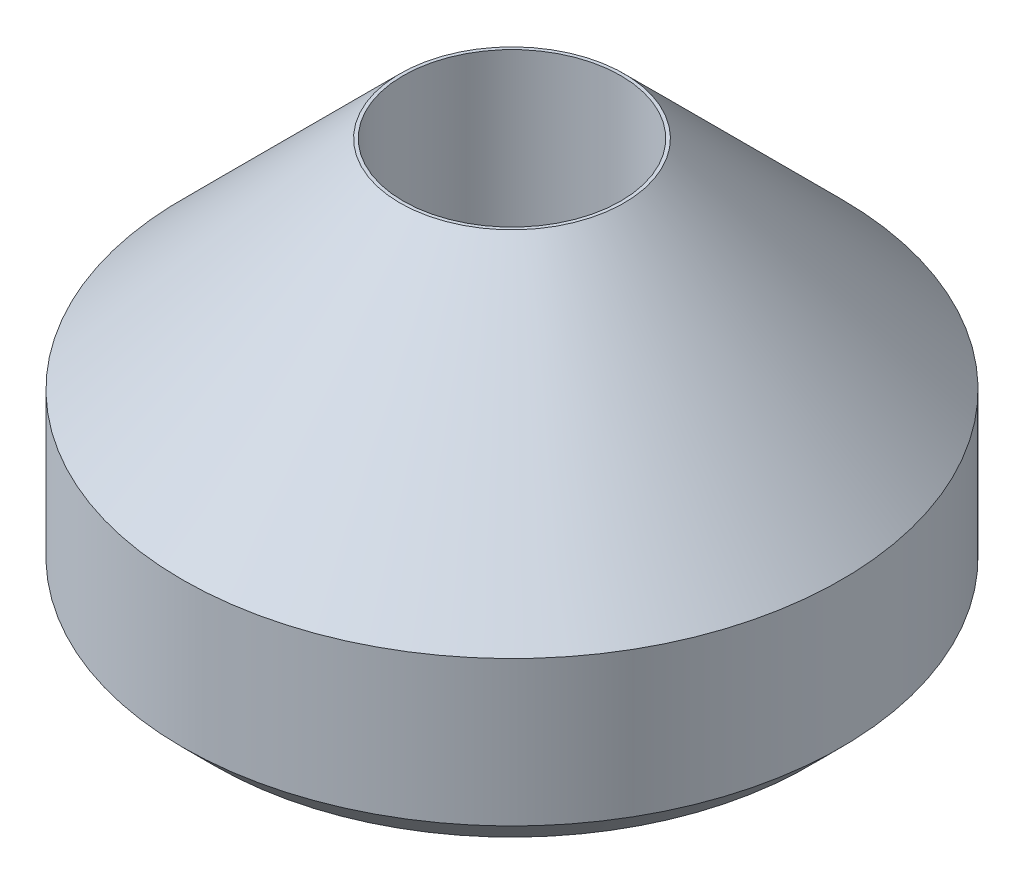
ISO-10303-21;
HEADER;
FILE_DESCRIPTION(('STEP AP214'),'2;1');
FILE_NAME('part.step','',(''),(''),'','','');
FILE_SCHEMA(('AUTOMOTIVE_DESIGN { 1 0 10303 214 1 1 1 1 }'));
ENDSEC;
DATA;
#1=APPLICATION_CONTEXT('core data for automotive mechanical design processes');
#2=APPLICATION_PROTOCOL_DEFINITION('international standard','automotive_design',2000,#1);
#3=PRODUCT_CONTEXT('',#1,'mechanical');
#4=PRODUCT('Part','Part','',(#3));
#5=PRODUCT_RELATED_PRODUCT_CATEGORY('part','',(#4));
#6=PRODUCT_DEFINITION_FORMATION('','',#4);
#7=PRODUCT_DEFINITION_CONTEXT('part definition',#1,'design');
#8=PRODUCT_DEFINITION('design','',#6,#7);
#9=PRODUCT_DEFINITION_SHAPE('','',#8);
#10=(LENGTH_UNIT() NAMED_UNIT(*) SI_UNIT(.MILLI.,.METRE.));
#11=(NAMED_UNIT(*) PLANE_ANGLE_UNIT() SI_UNIT($,.RADIAN.));
#12=(NAMED_UNIT(*) SI_UNIT($,.STERADIAN.) SOLID_ANGLE_UNIT());
#13=UNCERTAINTY_MEASURE_WITH_UNIT(LENGTH_MEASURE(1.E-05),#10,'distance_accuracy_value','');
#14=(GEOMETRIC_REPRESENTATION_CONTEXT(3) GLOBAL_UNCERTAINTY_ASSIGNED_CONTEXT((#13)) GLOBAL_UNIT_ASSIGNED_CONTEXT((#10,
#11,#12)) REPRESENTATION_CONTEXT('',''));
#15=CARTESIAN_POINT('',(0.,0.,0.));
#16=DIRECTION('',(0.,0.,1.));
#17=DIRECTION('',(1.,0.,0.));
#18=AXIS2_PLACEMENT_3D('',#15,#16,#17);
#19=CARTESIAN_POINT('',(0.,1.,0.));
#20=DIRECTION('',(0.,-1.,0.));
#21=DIRECTION('',(0.,0.,-1.));
#22=AXIS2_PLACEMENT_3D('',#19,#20,#21);
#23=CYLINDRICAL_SURFACE('',#22,5.);
#24=CARTESIAN_POINT('',(0.,0.499999999999998,0.));
#25=DIRECTION('',(0.,1.,0.));
#26=DIRECTION('',(0.,0.,1.));
#27=AXIS2_PLACEMENT_3D('',#24,#25,#26);
#28=CIRCLE('',#27,5.);
#29=CARTESIAN_POINT('',(0.,0.499999999999998,5.));
#30=VERTEX_POINT('',#29);
#31=EDGE_CURVE('E190',#30,#30,#28,.T.);
#32=ORIENTED_EDGE('',*,*,#31,.T.);
#33=EDGE_LOOP('',(#32));
#34=FACE_BOUND('',#33,.T.);
#35=CARTESIAN_POINT('',(0.,2.69999999999999,0.));
#36=DIRECTION('',(0.,1.,0.));
#37=DIRECTION('',(0.,0.,1.));
#38=AXIS2_PLACEMENT_3D('',#35,#36,#37);
#39=CIRCLE('',#38,5.);
#40=CARTESIAN_POINT('',(0.,2.69999999999999,5.));
#41=VERTEX_POINT('',#40);
#42=EDGE_CURVE('E186',#41,#41,#39,.F.);
#43=ORIENTED_EDGE('',*,*,#42,.T.);
#44=EDGE_LOOP('',(#43));
#45=FACE_BOUND('',#44,.T.);
#46=ADVANCED_FACE('F45',(#34,#45),#23,.T.);
#47=CARTESIAN_POINT('',(0.,0.,0.));
#48=DIRECTION('',(0.,1.,0.));
#49=DIRECTION('',(0.,0.,1.));
#50=AXIS2_PLACEMENT_3D('',#47,#48,#49);
#51=PLANE('',#50);
#52=CARTESIAN_POINT('',(0.,0.,-3.));
#53=DIRECTION('',(0.,1.,0.));
#54=DIRECTION('',(0.,0.,1.));
#55=AXIS2_PLACEMENT_3D('',#52,#53,#54);
#56=CIRCLE('',#55,0.5);
#57=CARTESIAN_POINT('',(0.5,0.,-3.));
#58=VERTEX_POINT('',#57);
#59=CARTESIAN_POINT('',(0.,0.,-3.5));
#60=VERTEX_POINT('',#59);
#61=EDGE_CURVE('E248',#58,#60,#56,.T.);
#62=ORIENTED_EDGE('',*,*,#61,.T.);
#63=CARTESIAN_POINT('',(0.,0.,-3.));
#64=DIRECTION('',(0.,1.,0.));
#65=DIRECTION('',(0.,0.,1.));
#66=AXIS2_PLACEMENT_3D('',#63,#64,#65);
#67=CIRCLE('',#66,0.5);
#68=CARTESIAN_POINT('',(-0.5,0.,-3.));
#69=VERTEX_POINT('',#68);
#70=EDGE_CURVE('E142',#60,#69,#67,.T.);
#71=ORIENTED_EDGE('',*,*,#70,.T.);
#72=DIRECTION('',(0.,0.,-1.));
#73=VECTOR('',#72,1.);
#74=CARTESIAN_POINT('',(-0.5,0.,-3.5));
#75=LINE('',#74,#73);
#76=CARTESIAN_POINT('',(-0.5,0.,-0.5));
#77=VERTEX_POINT('',#76);
#78=EDGE_CURVE('E170',#77,#69,#75,.T.);
#79=ORIENTED_EDGE('',*,*,#78,.F.);
#80=CARTESIAN_POINT('',(0.,0.,-0.5));
#81=DIRECTION('',(0.,1.,0.));
#82=DIRECTION('',(0.,0.,1.));
#83=AXIS2_PLACEMENT_3D('',#80,#81,#82);
#84=CIRCLE('',#83,0.5);
#85=CARTESIAN_POINT('',(0.,0.,0.));
#86=VERTEX_POINT('',#85);
#87=EDGE_CURVE('E69',#77,#86,#84,.T.);
#88=ORIENTED_EDGE('',*,*,#87,.T.);
#89=CARTESIAN_POINT('',(0.,0.,-0.5));
#90=DIRECTION('',(0.,1.,0.));
#91=DIRECTION('',(0.,0.,1.));
#92=AXIS2_PLACEMENT_3D('',#89,#90,#91);
#93=CIRCLE('',#92,0.5);
#94=CARTESIAN_POINT('',(0.5,0.,-0.5));
#95=VERTEX_POINT('',#94);
#96=EDGE_CURVE('E251',#86,#95,#93,.T.);
#97=ORIENTED_EDGE('',*,*,#96,.T.);
#98=DIRECTION('',(0.,0.,1.));
#99=VECTOR('',#98,1.);
#100=CARTESIAN_POINT('',(0.5,0.,0.));
#101=LINE('',#100,#99);
#102=EDGE_CURVE('E290',#58,#95,#101,.T.);
#103=ORIENTED_EDGE('',*,*,#102,.F.);
#104=EDGE_LOOP('',(#62,#71,#79,#88,#97,#103));
#105=FACE_BOUND('',#104,.T.);
#106=CARTESIAN_POINT('',(-2.10623800172387,0.,-2.13629620607589));
#107=DIRECTION('',(0.,1.,0.));
#108=DIRECTION('',(0.,0.,1.));
#109=AXIS2_PLACEMENT_3D('',#106,#107,#108);
#110=CIRCLE('',#109,0.5);
#111=CARTESIAN_POINT('',(-1.75519833476989,0.,-1.78024683839657));
#112=VERTEX_POINT('',#111);
#113=CARTESIAN_POINT('',(-1.69666197957938,0.,-2.42308442425141));
#114=VERTEX_POINT('',#113);
#115=EDGE_CURVE('E55',#112,#114,#110,.T.);
#116=ORIENTED_EDGE('',*,*,#115,.T.);
#117=CARTESIAN_POINT('',(-2.10623800172387,0.,-2.13629620607589));
#118=DIRECTION('',(0.,1.,0.));
#119=DIRECTION('',(0.,0.,1.));
#120=AXIS2_PLACEMENT_3D('',#117,#118,#119);
#121=CIRCLE('',#120,0.5);
#122=CARTESIAN_POINT('',(-2.45727766867785,0.,-2.4923455737552));
#123=VERTEX_POINT('',#122);
#124=EDGE_CURVE('E11',#114,#123,#121,.T.);
#125=ORIENTED_EDGE('',*,*,#124,.T.);
#126=CARTESIAN_POINT('',(0.,0.,0.));
#127=DIRECTION('',(0.,-1.,0.));
#128=DIRECTION('',(0.,0.,-1.));
#129=AXIS2_PLACEMENT_3D('',#126,#127,#128);
#130=CIRCLE('',#129,3.5);
#131=CARTESIAN_POINT('',(2.45727766867785,0.,-2.4923455737552));
#132=VERTEX_POINT('',#131);
#133=EDGE_CURVE('E163',#132,#123,#130,.T.);
#134=ORIENTED_EDGE('',*,*,#133,.F.);
#135=CARTESIAN_POINT('',(2.10623800172387,0.,-2.13629620607589));
#136=DIRECTION('',(0.,1.,0.));
#137=DIRECTION('',(0.,0.,1.));
#138=AXIS2_PLACEMENT_3D('',#135,#136,#137);
#139=CIRCLE('',#138,0.5);
#140=CARTESIAN_POINT('',(1.69666197957938,0.,-2.42308442425141));
#141=VERTEX_POINT('',#140);
#142=EDGE_CURVE('E245',#132,#141,#139,.T.);
#143=ORIENTED_EDGE('',*,*,#142,.T.);
#144=CARTESIAN_POINT('',(2.10623800172387,0.,-2.13629620607589));
#145=DIRECTION('',(0.,1.,0.));
#146=DIRECTION('',(0.,0.,1.));
#147=AXIS2_PLACEMENT_3D('',#144,#145,#146);
#148=CIRCLE('',#147,0.5);
#149=CARTESIAN_POINT('',(1.7551983347699,0.,-1.78024683839657));
#150=VERTEX_POINT('',#149);
#151=EDGE_CURVE('E160',#141,#150,#148,.T.);
#152=ORIENTED_EDGE('',*,*,#151,.T.);
#153=CARTESIAN_POINT('',(0.,0.,0.));
#154=DIRECTION('',(0.,1.,0.));
#155=DIRECTION('',(0.,0.,-1.));
#156=AXIS2_PLACEMENT_3D('',#153,#154,#155);
#157=CIRCLE('',#156,2.5);
#158=EDGE_CURVE('E149',#112,#150,#157,.T.);
#159=ORIENTED_EDGE('',*,*,#158,.F.);
#160=EDGE_LOOP('',(#116,#125,#134,#143,#152,#159));
#161=FACE_BOUND('',#160,.T.);
#162=CARTESIAN_POINT('',(0.,0.,0.));
#163=DIRECTION('',(0.,1.,0.));
#164=DIRECTION('',(0.,0.,1.));
#165=AXIS2_PLACEMENT_3D('',#162,#163,#164);
#166=CIRCLE('',#165,4.5);
#167=CARTESIAN_POINT('',(0.,0.,4.5));
#168=VERTEX_POINT('',#167);
#169=EDGE_CURVE('E155',#168,#168,#166,.F.);
#170=ORIENTED_EDGE('',*,*,#169,.T.);
#171=EDGE_LOOP('',(#170));
#172=FACE_BOUND('',#171,.T.);
#173=ADVANCED_FACE('F157',(#105,#161,#172),#51,.F.);
#174=CARTESIAN_POINT('',(0.,6.,0.));
#175=DIRECTION('',(0.,1.,0.));
#176=DIRECTION('',(0.,0.,1.));
#177=AXIS2_PLACEMENT_3D('',#174,#175,#176);
#178=PLANE('',#177);
#179=CARTESIAN_POINT('',(0.,6.,0.));
#180=DIRECTION('',(0.,1.,0.));
#181=DIRECTION('',(0.,0.,1.));
#182=AXIS2_PLACEMENT_3D('',#179,#180,#181);
#183=CIRCLE('',#182,1.7);
#184=CARTESIAN_POINT('',(0.,6.,1.7));
#185=VERTEX_POINT('',#184);
#186=EDGE_CURVE('E178',#185,#185,#183,.T.);
#187=ORIENTED_EDGE('',*,*,#186,.T.);
#188=EDGE_LOOP('',(#187));
#189=FACE_BOUND('',#188,.T.);
#190=CARTESIAN_POINT('',(0.,6.,0.));
#191=DIRECTION('',(0.,1.,0.));
#192=DIRECTION('',(0.,0.,1.));
#193=AXIS2_PLACEMENT_3D('',#190,#191,#192);
#194=CIRCLE('',#193,1.65);
#195=CARTESIAN_POINT('',(0.,6.,1.65));
#196=VERTEX_POINT('',#195);
#197=EDGE_CURVE('E179',#196,#196,#194,.T.);
#198=ORIENTED_EDGE('',*,*,#197,.F.);
#199=EDGE_LOOP('',(#198));
#200=FACE_BOUND('',#199,.T.);
#201=ADVANCED_FACE('F334',(#189,#200),#178,.T.);
#202=CARTESIAN_POINT('',(0.,3.,0.));
#203=DIRECTION('',(0.,1.,0.));
#204=DIRECTION('',(0.,0.,1.));
#205=AXIS2_PLACEMENT_3D('',#202,#203,#204);
#206=CYLINDRICAL_SURFACE('',#205,1.65);
#207=CARTESIAN_POINT('',(0.,3.,0.));
#208=DIRECTION('',(0.,1.,0.));
#209=DIRECTION('',(0.,0.,1.));
#210=AXIS2_PLACEMENT_3D('',#207,#208,#209);
#211=CIRCLE('',#210,1.65);
#212=CARTESIAN_POINT('',(0.,3.,1.65));
#213=VERTEX_POINT('',#212);
#214=EDGE_CURVE('E174',#213,#213,#211,.T.);
#215=ORIENTED_EDGE('',*,*,#214,.F.);
#216=EDGE_LOOP('',(#215));
#217=FACE_BOUND('',#216,.T.);
#218=ORIENTED_EDGE('',*,*,#197,.T.);
#219=EDGE_LOOP('',(#218));
#220=FACE_BOUND('',#219,.T.);
#221=ADVANCED_FACE('F367',(#217,#220),#206,.F.);
#222=CARTESIAN_POINT('',(0.,3.,0.));
#223=DIRECTION('',(0.,1.,0.));
#224=DIRECTION('',(0.,0.,1.));
#225=AXIS2_PLACEMENT_3D('',#222,#223,#224);
#226=PLANE('',#225);
#227=ORIENTED_EDGE('',*,*,#214,.T.);
#228=EDGE_LOOP('',(#227));
#229=FACE_BOUND('',#228,.T.);
#230=ADVANCED_FACE('F346',(#229),#226,.T.);
#231=CARTESIAN_POINT('',(0.,6.,0.));
#232=DIRECTION('',(0.,-1.,0.));
#233=DIRECTION('',(0.,0.,-1.));
#234=AXIS2_PLACEMENT_3D('',#231,#232,#233);
#235=CONICAL_SURFACE('',#234,1.7,0.785398163397447);
#236=ORIENTED_EDGE('',*,*,#42,.F.);
#237=EDGE_LOOP('',(#236));
#238=FACE_BOUND('',#237,.T.);
#239=ORIENTED_EDGE('',*,*,#186,.F.);
#240=EDGE_LOOP('',(#239));
#241=FACE_BOUND('',#240,.T.);
#242=ADVANCED_FACE('F340',(#238,#241),#235,.T.);
#243=CARTESIAN_POINT('',(0.,0.499999999999998,0.));
#244=DIRECTION('',(0.,1.,0.));
#245=DIRECTION('',(0.,0.,1.));
#246=AXIS2_PLACEMENT_3D('',#243,#244,#245);
#247=CONICAL_SURFACE('',#246,5.,0.785398163397449);
#248=ORIENTED_EDGE('',*,*,#169,.F.);
#249=EDGE_LOOP('',(#248));
#250=FACE_BOUND('',#249,.T.);
#251=ORIENTED_EDGE('',*,*,#31,.F.);
#252=EDGE_LOOP('',(#251));
#253=FACE_BOUND('',#252,.T.);
#254=ADVANCED_FACE('F345',(#250,#253),#247,.T.);
#255=CARTESIAN_POINT('',(0.,1.,0.));
#256=DIRECTION('',(0.,-1.,0.));
#257=DIRECTION('',(0.,0.,-1.));
#258=AXIS2_PLACEMENT_3D('',#255,#256,#257);
#259=CYLINDRICAL_SURFACE('',#258,3.5);
#260=CARTESIAN_POINT('',(0.,1.,0.));
#261=DIRECTION('',(0.,-1.,0.));
#262=DIRECTION('',(0.,0.,-1.));
#263=AXIS2_PLACEMENT_3D('',#260,#261,#262);
#264=CIRCLE('',#263,3.5);
#265=CARTESIAN_POINT('',(2.45727766867785,1.,-2.4923455737552));
#266=VERTEX_POINT('',#265);
#267=CARTESIAN_POINT('',(-2.45727766867785,1.,-2.4923455737552));
#268=VERTEX_POINT('',#267);
#269=EDGE_CURVE('E162',#266,#268,#264,.T.);
#270=ORIENTED_EDGE('',*,*,#269,.F.);
#271=DIRECTION('',(0.,-1.,0.));
#272=VECTOR('',#271,1.);
#273=CARTESIAN_POINT('',(2.45727766867785,1.,-2.4923455737552));
#274=LINE('',#273,#272);
#275=EDGE_CURVE('E214',#266,#132,#274,.T.);
#276=ORIENTED_EDGE('',*,*,#275,.T.);
#277=ORIENTED_EDGE('',*,*,#133,.T.);
#278=DIRECTION('',(0.,-1.,0.));
#279=VECTOR('',#278,1.);
#280=CARTESIAN_POINT('',(-2.45727766867785,1.,-2.4923455737552));
#281=LINE('',#280,#279);
#282=EDGE_CURVE('E211',#123,#268,#281,.F.);
#283=ORIENTED_EDGE('',*,*,#282,.T.);
#284=EDGE_LOOP('',(#270,#276,#277,#283));
#285=FACE_BOUND('',#284,.T.);
#286=ADVANCED_FACE('F309',(#285),#259,.F.);
#287=CARTESIAN_POINT('',(0.,1.,0.));
#288=DIRECTION('',(0.,-1.,0.));
#289=DIRECTION('',(0.,0.,-1.));
#290=AXIS2_PLACEMENT_3D('',#287,#288,#289);
#291=CYLINDRICAL_SURFACE('',#290,2.5);
#292=ORIENTED_EDGE('',*,*,#158,.T.);
#293=DIRECTION('',(0.,-1.,0.));
#294=VECTOR('',#293,1.);
#295=CARTESIAN_POINT('',(1.7551983347699,1.,-1.78024683839657));
#296=LINE('',#295,#294);
#297=CARTESIAN_POINT('',(1.7551983347699,1.,-1.78024683839657));
#298=VERTEX_POINT('',#297);
#299=EDGE_CURVE('E154',#150,#298,#296,.F.);
#300=ORIENTED_EDGE('',*,*,#299,.T.);
#301=CARTESIAN_POINT('',(0.,1.,0.));
#302=DIRECTION('',(0.,1.,0.));
#303=DIRECTION('',(0.,0.,-1.));
#304=AXIS2_PLACEMENT_3D('',#301,#302,#303);
#305=CIRCLE('',#304,2.5);
#306=CARTESIAN_POINT('',(-1.75519833476989,1.,-1.78024683839657));
#307=VERTEX_POINT('',#306);
#308=EDGE_CURVE('E152',#307,#298,#305,.T.);
#309=ORIENTED_EDGE('',*,*,#308,.F.);
#310=DIRECTION('',(0.,-1.,0.));
#311=VECTOR('',#310,1.);
#312=CARTESIAN_POINT('',(-1.75519833476989,1.,-1.78024683839657));
#313=LINE('',#312,#311);
#314=EDGE_CURVE('E139',#307,#112,#313,.T.);
#315=ORIENTED_EDGE('',*,*,#314,.T.);
#316=EDGE_LOOP('',(#292,#300,#309,#315));
#317=FACE_BOUND('',#316,.T.);
#318=ADVANCED_FACE('F147',(#317),#291,.T.);
#319=CARTESIAN_POINT('',(0.,1.,0.));
#320=DIRECTION('',(0.,-1.,0.));
#321=DIRECTION('',(0.,0.,-1.));
#322=AXIS2_PLACEMENT_3D('',#319,#320,#321);
#323=PLANE('',#322);
#324=ORIENTED_EDGE('',*,*,#308,.T.);
#325=CARTESIAN_POINT('',(2.10623800172387,1.,-2.13629620607589));
#326=DIRECTION('',(0.,-1.,0.));
#327=DIRECTION('',(0.,0.,-1.));
#328=AXIS2_PLACEMENT_3D('',#325,#326,#327);
#329=CIRCLE('',#328,0.5);
#330=CARTESIAN_POINT('',(1.69666197957938,1.,-2.42308442425141));
#331=VERTEX_POINT('',#330);
#332=EDGE_CURVE('E208',#298,#331,#329,.T.);
#333=ORIENTED_EDGE('',*,*,#332,.T.);
#334=CARTESIAN_POINT('',(2.10623800172387,1.,-2.13629620607589));
#335=DIRECTION('',(0.,-1.,0.));
#336=DIRECTION('',(0.,0.,-1.));
#337=AXIS2_PLACEMENT_3D('',#334,#335,#336);
#338=CIRCLE('',#337,0.5);
#339=EDGE_CURVE('E205',#331,#266,#338,.T.);
#340=ORIENTED_EDGE('',*,*,#339,.T.);
#341=ORIENTED_EDGE('',*,*,#269,.T.);
#342=CARTESIAN_POINT('',(-2.10623800172387,1.,-2.13629620607589));
#343=DIRECTION('',(0.,-1.,0.));
#344=DIRECTION('',(0.,0.,-1.));
#345=AXIS2_PLACEMENT_3D('',#342,#343,#344);
#346=CIRCLE('',#345,0.5);
#347=CARTESIAN_POINT('',(-1.69666197957938,1.,-2.42308442425141));
#348=VERTEX_POINT('',#347);
#349=EDGE_CURVE('E199',#268,#348,#346,.T.);
#350=ORIENTED_EDGE('',*,*,#349,.T.);
#351=CARTESIAN_POINT('',(-2.10623800172387,1.,-2.13629620607589));
#352=DIRECTION('',(0.,-1.,0.));
#353=DIRECTION('',(0.,0.,-1.));
#354=AXIS2_PLACEMENT_3D('',#351,#352,#353);
#355=CIRCLE('',#354,0.5);
#356=EDGE_CURVE('E202',#348,#307,#355,.T.);
#357=ORIENTED_EDGE('',*,*,#356,.T.);
#358=EDGE_LOOP('',(#324,#333,#340,#341,#350,#357));
#359=FACE_BOUND('',#358,.T.);
#360=ADVANCED_FACE('F300',(#359),#323,.T.);
#361=CARTESIAN_POINT('',(-0.5,1.,-3.5));
#362=DIRECTION('',(-1.,0.,0.));
#363=DIRECTION('',(0.,0.,1.));
#364=AXIS2_PLACEMENT_3D('',#361,#362,#363);
#365=PLANE('',#364);
#366=DIRECTION('',(0.,0.,-1.));
#367=VECTOR('',#366,1.);
#368=CARTESIAN_POINT('',(-0.5,1.,-3.5));
#369=LINE('',#368,#367);
#370=CARTESIAN_POINT('',(-0.5,1.,-0.5));
#371=VERTEX_POINT('',#370);
#372=CARTESIAN_POINT('',(-0.5,1.,-3.));
#373=VERTEX_POINT('',#372);
#374=EDGE_CURVE('E283',#371,#373,#369,.T.);
#375=ORIENTED_EDGE('',*,*,#374,.F.);
#376=DIRECTION('',(0.,-1.,0.));
#377=VECTOR('',#376,1.);
#378=CARTESIAN_POINT('',(-0.5,0.,-0.5));
#379=LINE('',#378,#377);
#380=EDGE_CURVE('E240',#371,#77,#379,.T.);
#381=ORIENTED_EDGE('',*,*,#380,.T.);
#382=ORIENTED_EDGE('',*,*,#78,.T.);
#383=DIRECTION('',(0.,-1.,0.));
#384=VECTOR('',#383,1.);
#385=CARTESIAN_POINT('',(-0.5,1.,-3.));
#386=LINE('',#385,#384);
#387=EDGE_CURVE('E237',#69,#373,#386,.F.);
#388=ORIENTED_EDGE('',*,*,#387,.T.);
#389=EDGE_LOOP('',(#375,#381,#382,#388));
#390=FACE_BOUND('',#389,.T.);
#391=ADVANCED_FACE('F286',(#390),#365,.F.);
#392=CARTESIAN_POINT('',(0.5,1.,0.));
#393=DIRECTION('',(1.,0.,0.));
#394=DIRECTION('',(0.,0.,-1.));
#395=AXIS2_PLACEMENT_3D('',#392,#393,#394);
#396=PLANE('',#395);
#397=DIRECTION('',(0.,0.,1.));
#398=VECTOR('',#397,1.);
#399=CARTESIAN_POINT('',(0.5,1.,0.));
#400=LINE('',#399,#398);
#401=CARTESIAN_POINT('',(0.5,1.,-3.));
#402=VERTEX_POINT('',#401);
#403=CARTESIAN_POINT('',(0.5,1.,-0.5));
#404=VERTEX_POINT('',#403);
#405=EDGE_CURVE('E262',#402,#404,#400,.T.);
#406=ORIENTED_EDGE('',*,*,#405,.F.);
#407=DIRECTION('',(0.,-1.,0.));
#408=VECTOR('',#407,1.);
#409=CARTESIAN_POINT('',(0.5,0.,-3.));
#410=LINE('',#409,#408);
#411=EDGE_CURVE('E221',#402,#58,#410,.T.);
#412=ORIENTED_EDGE('',*,*,#411,.T.);
#413=ORIENTED_EDGE('',*,*,#102,.T.);
#414=DIRECTION('',(0.,-1.,0.));
#415=VECTOR('',#414,1.);
#416=CARTESIAN_POINT('',(0.5,1.,-0.5));
#417=LINE('',#416,#415);
#418=EDGE_CURVE('E217',#95,#404,#417,.F.);
#419=ORIENTED_EDGE('',*,*,#418,.T.);
#420=EDGE_LOOP('',(#406,#412,#413,#419));
#421=FACE_BOUND('',#420,.T.);
#422=ADVANCED_FACE('F439',(#421),#396,.F.);
#423=CARTESIAN_POINT('',(0.,1.,0.));
#424=DIRECTION('',(0.,1.,0.));
#425=DIRECTION('',(0.,0.,1.));
#426=AXIS2_PLACEMENT_3D('',#423,#424,#425);
#427=PLANE('',#426);
#428=ORIENTED_EDGE('',*,*,#405,.T.);
#429=CARTESIAN_POINT('',(0.,1.,-0.5));
#430=DIRECTION('',(0.,1.,0.));
#431=DIRECTION('',(0.,0.,1.));
#432=AXIS2_PLACEMENT_3D('',#429,#430,#431);
#433=CIRCLE('',#432,0.5);
#434=CARTESIAN_POINT('',(0.,1.,0.));
#435=VERTEX_POINT('',#434);
#436=EDGE_CURVE('E234',#404,#435,#433,.F.);
#437=ORIENTED_EDGE('',*,*,#436,.T.);
#438=CARTESIAN_POINT('',(0.,1.,-0.5));
#439=DIRECTION('',(0.,1.,0.));
#440=DIRECTION('',(0.,0.,1.));
#441=AXIS2_PLACEMENT_3D('',#438,#439,#440);
#442=CIRCLE('',#441,0.5);
#443=EDGE_CURVE('E231',#435,#371,#442,.F.);
#444=ORIENTED_EDGE('',*,*,#443,.T.);
#445=ORIENTED_EDGE('',*,*,#374,.T.);
#446=CARTESIAN_POINT('',(0.,1.,-3.));
#447=DIRECTION('',(0.,1.,0.));
#448=DIRECTION('',(0.,0.,1.));
#449=AXIS2_PLACEMENT_3D('',#446,#447,#448);
#450=CIRCLE('',#449,0.5);
#451=CARTESIAN_POINT('',(0.,1.,-3.5));
#452=VERTEX_POINT('',#451);
#453=EDGE_CURVE('E225',#373,#452,#450,.F.);
#454=ORIENTED_EDGE('',*,*,#453,.T.);
#455=CARTESIAN_POINT('',(0.,1.,-3.));
#456=DIRECTION('',(0.,1.,0.));
#457=DIRECTION('',(0.,0.,1.));
#458=AXIS2_PLACEMENT_3D('',#455,#456,#457);
#459=CIRCLE('',#458,0.5);
#460=EDGE_CURVE('E228',#452,#402,#459,.F.);
#461=ORIENTED_EDGE('',*,*,#460,.T.);
#462=EDGE_LOOP('',(#428,#437,#444,#445,#454,#461));
#463=FACE_BOUND('',#462,.T.);
#464=ADVANCED_FACE('F282',(#463),#427,.F.);
#465=CARTESIAN_POINT('',(2.10623800172387,1.,-2.13629620607589));
#466=DIRECTION('',(0.,-1.,0.));
#467=DIRECTION('',(0.,0.,-1.));
#468=AXIS2_PLACEMENT_3D('',#465,#466,#467);
#469=CYLINDRICAL_SURFACE('',#468,0.5);
#470=ORIENTED_EDGE('',*,*,#275,.F.);
#471=ORIENTED_EDGE('',*,*,#339,.F.);
#472=DIRECTION('',(0.,1.,0.));
#473=VECTOR('',#472,1.);
#474=CARTESIAN_POINT('',(1.69666197957938,1.,-2.42308442425141));
#475=LINE('',#474,#473);
#476=EDGE_CURVE('E258',#141,#331,#475,.T.);
#477=ORIENTED_EDGE('',*,*,#476,.F.);
#478=ORIENTED_EDGE('',*,*,#142,.F.);
#479=EDGE_LOOP('',(#470,#471,#477,#478));
#480=FACE_BOUND('',#479,.T.);
#481=ADVANCED_FACE('F312',(#480),#469,.F.);
#482=CARTESIAN_POINT('',(2.10623800172387,1.,-2.13629620607589));
#483=DIRECTION('',(0.,-1.,0.));
#484=DIRECTION('',(0.,0.,-1.));
#485=AXIS2_PLACEMENT_3D('',#482,#483,#484);
#486=CYLINDRICAL_SURFACE('',#485,0.5);
#487=ORIENTED_EDGE('',*,*,#332,.F.);
#488=ORIENTED_EDGE('',*,*,#299,.F.);
#489=ORIENTED_EDGE('',*,*,#151,.F.);
#490=ORIENTED_EDGE('',*,*,#476,.T.);
#491=EDGE_LOOP('',(#487,#488,#489,#490));
#492=FACE_BOUND('',#491,.T.);
#493=ADVANCED_FACE('F315',(#492),#486,.F.);
#494=CARTESIAN_POINT('',(0.,1.,-3.));
#495=DIRECTION('',(0.,1.,0.));
#496=DIRECTION('',(0.,0.,1.));
#497=AXIS2_PLACEMENT_3D('',#494,#495,#496);
#498=CYLINDRICAL_SURFACE('',#497,0.5);
#499=DIRECTION('',(0.,-1.,0.));
#500=VECTOR('',#499,1.);
#501=CARTESIAN_POINT('',(0.,0.,-3.5));
#502=LINE('',#501,#500);
#503=EDGE_CURVE('E263',#452,#60,#502,.T.);
#504=ORIENTED_EDGE('',*,*,#503,.F.);
#505=ORIENTED_EDGE('',*,*,#453,.F.);
#506=ORIENTED_EDGE('',*,*,#387,.F.);
#507=ORIENTED_EDGE('',*,*,#70,.F.);
#508=EDGE_LOOP('',(#504,#505,#506,#507));
#509=FACE_BOUND('',#508,.T.);
#510=ADVANCED_FACE('F317',(#509),#498,.F.);
#511=CARTESIAN_POINT('',(0.,1.,-3.));
#512=DIRECTION('',(0.,1.,0.));
#513=DIRECTION('',(0.,0.,1.));
#514=AXIS2_PLACEMENT_3D('',#511,#512,#513);
#515=CYLINDRICAL_SURFACE('',#514,0.5);
#516=ORIENTED_EDGE('',*,*,#460,.F.);
#517=ORIENTED_EDGE('',*,*,#503,.T.);
#518=ORIENTED_EDGE('',*,*,#61,.F.);
#519=ORIENTED_EDGE('',*,*,#411,.F.);
#520=EDGE_LOOP('',(#516,#517,#518,#519));
#521=FACE_BOUND('',#520,.T.);
#522=ADVANCED_FACE('F323',(#521),#515,.F.);
#523=CARTESIAN_POINT('',(0.,1.,-0.5));
#524=DIRECTION('',(0.,1.,0.));
#525=DIRECTION('',(0.,0.,1.));
#526=AXIS2_PLACEMENT_3D('',#523,#524,#525);
#527=CYLINDRICAL_SURFACE('',#526,0.5);
#528=ORIENTED_EDGE('',*,*,#380,.F.);
#529=ORIENTED_EDGE('',*,*,#443,.F.);
#530=DIRECTION('',(0.,-1.,0.));
#531=VECTOR('',#530,1.);
#532=CARTESIAN_POINT('',(0.,1.,0.));
#533=LINE('',#532,#531);
#534=EDGE_CURVE('E266',#86,#435,#533,.F.);
#535=ORIENTED_EDGE('',*,*,#534,.F.);
#536=ORIENTED_EDGE('',*,*,#87,.F.);
#537=EDGE_LOOP('',(#528,#529,#535,#536));
#538=FACE_BOUND('',#537,.T.);
#539=ADVANCED_FACE('F277',(#538),#527,.F.);
#540=CARTESIAN_POINT('',(0.,1.,-0.5));
#541=DIRECTION('',(0.,1.,0.));
#542=DIRECTION('',(0.,0.,1.));
#543=AXIS2_PLACEMENT_3D('',#540,#541,#542);
#544=CYLINDRICAL_SURFACE('',#543,0.5);
#545=ORIENTED_EDGE('',*,*,#436,.F.);
#546=ORIENTED_EDGE('',*,*,#418,.F.);
#547=ORIENTED_EDGE('',*,*,#96,.F.);
#548=ORIENTED_EDGE('',*,*,#534,.T.);
#549=EDGE_LOOP('',(#545,#546,#547,#548));
#550=FACE_BOUND('',#549,.T.);
#551=ADVANCED_FACE('F272',(#550),#544,.F.);
#552=CARTESIAN_POINT('',(-2.10623800172387,1.,-2.13629620607589));
#553=DIRECTION('',(0.,-1.,0.));
#554=DIRECTION('',(0.,0.,-1.));
#555=AXIS2_PLACEMENT_3D('',#552,#553,#554);
#556=CYLINDRICAL_SURFACE('',#555,0.5);
#557=DIRECTION('',(0.,1.,0.));
#558=VECTOR('',#557,1.);
#559=CARTESIAN_POINT('',(-1.69666197957938,0.,-2.42308442425141));
#560=LINE('',#559,#558);
#561=EDGE_CURVE('E49',#348,#114,#560,.F.);
#562=ORIENTED_EDGE('',*,*,#561,.F.);
#563=ORIENTED_EDGE('',*,*,#349,.F.);
#564=ORIENTED_EDGE('',*,*,#282,.F.);
#565=ORIENTED_EDGE('',*,*,#124,.F.);
#566=EDGE_LOOP('',(#562,#563,#564,#565));
#567=FACE_BOUND('',#566,.T.);
#568=ADVANCED_FACE('F47',(#567),#556,.F.);
#569=CARTESIAN_POINT('',(-2.10623800172387,1.,-2.13629620607589));
#570=DIRECTION('',(0.,-1.,0.));
#571=DIRECTION('',(0.,0.,-1.));
#572=AXIS2_PLACEMENT_3D('',#569,#570,#571);
#573=CYLINDRICAL_SURFACE('',#572,0.5);
#574=ORIENTED_EDGE('',*,*,#356,.F.);
#575=ORIENTED_EDGE('',*,*,#561,.T.);
#576=ORIENTED_EDGE('',*,*,#115,.F.);
#577=ORIENTED_EDGE('',*,*,#314,.F.);
#578=EDGE_LOOP('',(#574,#575,#576,#577));
#579=FACE_BOUND('',#578,.T.);
#580=ADVANCED_FACE('F138',(#579),#573,.F.);
#581=CLOSED_SHELL('',(#46,#173,#201,#221,#230,#242,#254,#286,#318,#360,#391,#422,#464,#481,#493,
#510,#522,#539,#551,#568,#580));
#582=MANIFOLD_SOLID_BREP('B2',#581);
#583=ADVANCED_BREP_SHAPE_REPRESENTATION('',(#18,#582),#14);
#584=SHAPE_DEFINITION_REPRESENTATION(#9,#583);
ENDSEC;
END-ISO-10303-21;
